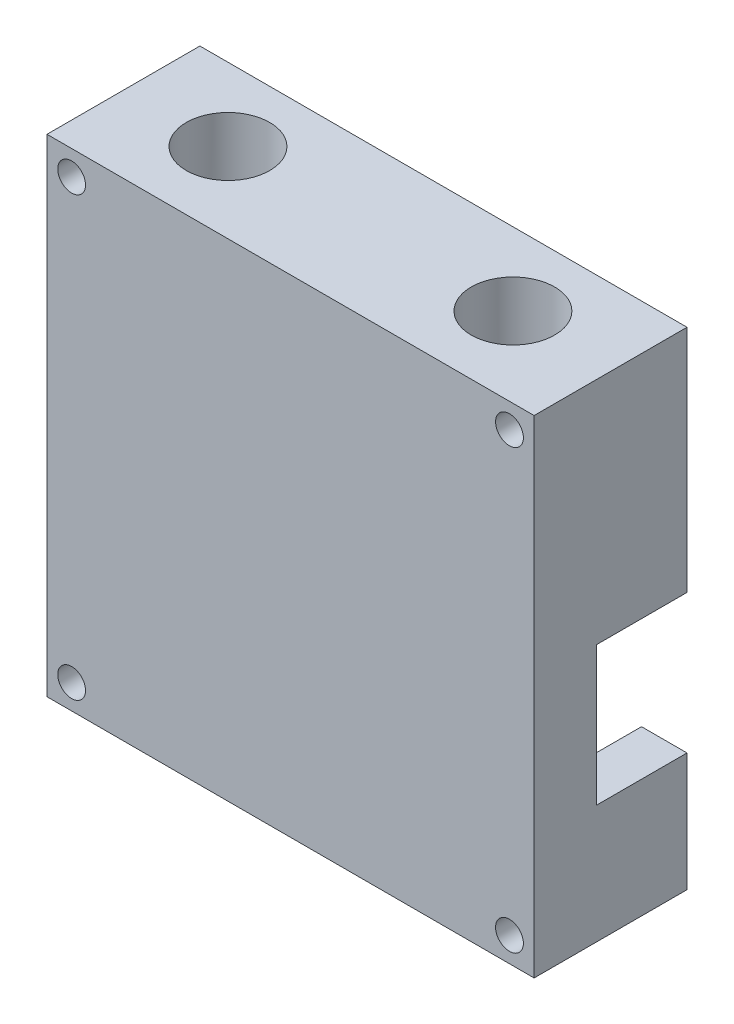
ISO-10303-21;
HEADER;
FILE_DESCRIPTION(('STEP AP214'),'2;1');
FILE_NAME('part.step','',(''),(''),'','','');
FILE_SCHEMA(('AUTOMOTIVE_DESIGN { 1 0 10303 214 1 1 1 1 }'));
ENDSEC;
DATA;
#1=APPLICATION_CONTEXT('core data for automotive mechanical design processes');
#2=APPLICATION_PROTOCOL_DEFINITION('international standard','automotive_design',2000,#1);
#3=PRODUCT_CONTEXT('',#1,'mechanical');
#4=PRODUCT('Part','Part','',(#3));
#5=PRODUCT_RELATED_PRODUCT_CATEGORY('part','',(#4));
#6=PRODUCT_DEFINITION_FORMATION('','',#4);
#7=PRODUCT_DEFINITION_CONTEXT('part definition',#1,'design');
#8=PRODUCT_DEFINITION('design','',#6,#7);
#9=PRODUCT_DEFINITION_SHAPE('','',#8);
#10=(LENGTH_UNIT() NAMED_UNIT(*) SI_UNIT(.MILLI.,.METRE.));
#11=(NAMED_UNIT(*) PLANE_ANGLE_UNIT() SI_UNIT($,.RADIAN.));
#12=(NAMED_UNIT(*) SI_UNIT($,.STERADIAN.) SOLID_ANGLE_UNIT());
#13=UNCERTAINTY_MEASURE_WITH_UNIT(LENGTH_MEASURE(1.E-05),#10,'distance_accuracy_value','');
#14=(GEOMETRIC_REPRESENTATION_CONTEXT(3) GLOBAL_UNCERTAINTY_ASSIGNED_CONTEXT((#13)) GLOBAL_UNIT_ASSIGNED_CONTEXT((#10,
#11,#12)) REPRESENTATION_CONTEXT('',''));
#15=CARTESIAN_POINT('',(0.,0.,0.));
#16=DIRECTION('',(0.,0.,1.));
#17=DIRECTION('',(1.,0.,0.));
#18=AXIS2_PLACEMENT_3D('',#15,#16,#17);
#19=CARTESIAN_POINT('',(0.,0.,0.));
#20=DIRECTION('',(0.,0.,1.));
#21=DIRECTION('',(1.,0.,0.));
#22=AXIS2_PLACEMENT_3D('',#19,#20,#21);
#23=PLANE('',#22);
#24=CARTESIAN_POINT('',(31.4999999999997,-31.5000000000003,0.));
#25=DIRECTION('',(0.,0.,1.));
#26=DIRECTION('',(1.,0.,0.));
#27=AXIS2_PLACEMENT_3D('',#24,#25,#26);
#28=CIRCLE('',#27,2.00000000000134);
#29=CARTESIAN_POINT('',(33.500000000001,-31.5000000000003,0.));
#30=VERTEX_POINT('',#29);
#31=EDGE_CURVE('E312',#30,#30,#28,.T.);
#32=ORIENTED_EDGE('',*,*,#31,.T.);
#33=EDGE_LOOP('',(#32));
#34=FACE_BOUND('',#33,.T.);
#35=DIRECTION('',(1.,0.,0.));
#36=VECTOR('',#35,1.);
#37=CARTESIAN_POINT('',(-35.0458892587831,-35.0458892587831,0.));
#38=LINE('',#37,#36);
#39=CARTESIAN_POINT('',(28.5,-35.0458892587831,0.));
#40=VERTEX_POINT('',#39);
#41=CARTESIAN_POINT('',(35.0458892587831,-35.0458892587831,0.));
#42=VERTEX_POINT('',#41);
#43=EDGE_CURVE('E370',#40,#42,#38,.T.);
#44=ORIENTED_EDGE('',*,*,#43,.F.);
#45=DIRECTION('',(0.,1.,0.));
#46=VECTOR('',#45,1.);
#47=CARTESIAN_POINT('',(28.5,25.5,0.));
#48=LINE('',#47,#46);
#49=CARTESIAN_POINT('',(28.5,-18.,0.));
#50=VERTEX_POINT('',#49);
#51=EDGE_CURVE('E185',#40,#50,#48,.T.);
#52=ORIENTED_EDGE('',*,*,#51,.T.);
#53=DIRECTION('',(1.,0.,0.));
#54=VECTOR('',#53,1.);
#55=CARTESIAN_POINT('',(25.0458892587831,-18.,0.));
#56=LINE('',#55,#54);
#57=CARTESIAN_POINT('',(35.0458892587831,-18.,0.));
#58=VERTEX_POINT('',#57);
#59=EDGE_CURVE('E213',#50,#58,#56,.T.);
#60=ORIENTED_EDGE('',*,*,#59,.T.);
#61=DIRECTION('',(0.,1.,0.));
#62=VECTOR('',#61,1.);
#63=CARTESIAN_POINT('',(35.0458892587831,35.0458892587831,0.));
#64=LINE('',#63,#62);
#65=EDGE_CURVE('E360',#42,#58,#64,.T.);
#66=ORIENTED_EDGE('',*,*,#65,.F.);
#67=EDGE_LOOP('',(#44,#52,#60,#66));
#68=FACE_BOUND('',#67,.T.);
#69=ADVANCED_FACE('F45',(#34,#68),#23,.F.);
#70=CARTESIAN_POINT('',(-31.5,-31.5,0.));
#71=DIRECTION('',(0.,0.,1.));
#72=DIRECTION('',(1.,0.,0.));
#73=AXIS2_PLACEMENT_3D('',#70,#71,#72);
#74=CIRCLE('',#73,2.00000000000134);
#75=CARTESIAN_POINT('',(-29.4999999999987,-31.5,0.));
#76=VERTEX_POINT('',#75);
#77=EDGE_CURVE('E317',#76,#76,#74,.T.);
#78=ORIENTED_EDGE('',*,*,#77,.T.);
#79=EDGE_LOOP('',(#78));
#80=FACE_BOUND('',#79,.T.);
#81=CARTESIAN_POINT('',(31.5000000000002,31.4999999999998,0.));
#82=DIRECTION('',(0.,0.,1.));
#83=DIRECTION('',(1.,0.,0.));
#84=AXIS2_PLACEMENT_3D('',#81,#82,#83);
#85=CIRCLE('',#84,2.00000000000134);
#86=CARTESIAN_POINT('',(33.5000000000016,31.4999999999998,0.));
#87=VERTEX_POINT('',#86);
#88=EDGE_CURVE('E325',#87,#87,#85,.T.);
#89=ORIENTED_EDGE('',*,*,#88,.T.);
#90=EDGE_LOOP('',(#89));
#91=FACE_BOUND('',#90,.T.);
#92=CARTESIAN_POINT('',(-31.4999999999999,31.5000000000001,0.));
#93=DIRECTION('',(0.,0.,1.));
#94=DIRECTION('',(1.,0.,0.));
#95=AXIS2_PLACEMENT_3D('',#92,#93,#94);
#96=CIRCLE('',#95,2.00000000000134);
#97=CARTESIAN_POINT('',(-29.4999999999986,31.5000000000001,0.));
#98=VERTEX_POINT('',#97);
#99=EDGE_CURVE('E333',#98,#98,#96,.T.);
#100=ORIENTED_EDGE('',*,*,#99,.T.);
#101=EDGE_LOOP('',(#100));
#102=FACE_BOUND('',#101,.T.);
#103=DIRECTION('',(0.,-1.,0.));
#104=VECTOR('',#103,1.);
#105=CARTESIAN_POINT('',(-28.5,25.5,0.));
#106=LINE('',#105,#104);
#107=CARTESIAN_POINT('',(-28.5,25.5,0.));
#108=VERTEX_POINT('',#107);
#109=CARTESIAN_POINT('',(-28.5,-35.0458892587831,0.));
#110=VERTEX_POINT('',#109);
#111=EDGE_CURVE('E280',#108,#110,#106,.T.);
#112=ORIENTED_EDGE('',*,*,#111,.T.);
#113=CARTESIAN_POINT('',(-35.0458892587831,-35.0458892587831,0.));
#114=VERTEX_POINT('',#113);
#115=EDGE_CURVE('E350',#114,#110,#38,.T.);
#116=ORIENTED_EDGE('',*,*,#115,.F.);
#117=DIRECTION('',(0.,-1.,0.));
#118=VECTOR('',#117,1.);
#119=CARTESIAN_POINT('',(-35.0458892587831,35.0458892587831,0.));
#120=LINE('',#119,#118);
#121=CARTESIAN_POINT('',(-35.0458892587831,35.0458892587831,0.));
#122=VERTEX_POINT('',#121);
#123=EDGE_CURVE('E367',#122,#114,#120,.T.);
#124=ORIENTED_EDGE('',*,*,#123,.F.);
#125=DIRECTION('',(-1.,0.,0.));
#126=VECTOR('',#125,1.);
#127=CARTESIAN_POINT('',(-35.0458892587831,35.0458892587831,0.));
#128=LINE('',#127,#126);
#129=CARTESIAN_POINT('',(35.0458892587831,35.0458892587831,0.));
#130=VERTEX_POINT('',#129);
#131=EDGE_CURVE('E364',#130,#122,#128,.T.);
#132=ORIENTED_EDGE('',*,*,#131,.F.);
#133=CARTESIAN_POINT('',(35.0458892587831,2.00000000000001,0.));
#134=VERTEX_POINT('',#133);
#135=EDGE_CURVE('E341',#134,#130,#64,.T.);
#136=ORIENTED_EDGE('',*,*,#135,.F.);
#137=DIRECTION('',(1.,0.,0.));
#138=VECTOR('',#137,1.);
#139=CARTESIAN_POINT('',(25.0458892587831,2.00000000000001,0.));
#140=LINE('',#139,#138);
#141=CARTESIAN_POINT('',(28.5,2.00000000000001,0.));
#142=VERTEX_POINT('',#141);
#143=EDGE_CURVE('E212',#142,#134,#140,.T.);
#144=ORIENTED_EDGE('',*,*,#143,.F.);
#145=CARTESIAN_POINT('',(28.5,25.5,0.));
#146=VERTEX_POINT('',#145);
#147=EDGE_CURVE('E283',#142,#146,#48,.T.);
#148=ORIENTED_EDGE('',*,*,#147,.T.);
#149=DIRECTION('',(-1.,0.,0.));
#150=VECTOR('',#149,1.);
#151=CARTESIAN_POINT('',(13.5,25.5,0.));
#152=LINE('',#151,#150);
#153=CARTESIAN_POINT('',(13.5,25.5,0.));
#154=VERTEX_POINT('',#153);
#155=EDGE_CURVE('E260',#146,#154,#152,.T.);
#156=ORIENTED_EDGE('',*,*,#155,.T.);
#157=DIRECTION('',(0.,1.,0.));
#158=VECTOR('',#157,1.);
#159=CARTESIAN_POINT('',(13.5,29.,0.));
#160=LINE('',#159,#158);
#161=CARTESIAN_POINT('',(13.5,29.,0.));
#162=VERTEX_POINT('',#161);
#163=EDGE_CURVE('E264',#154,#162,#160,.T.);
#164=ORIENTED_EDGE('',*,*,#163,.T.);
#165=DIRECTION('',(-1.,0.,0.));
#166=VECTOR('',#165,1.);
#167=CARTESIAN_POINT('',(13.5,29.,0.));
#168=LINE('',#167,#166);
#169=CARTESIAN_POINT('',(-13.5,29.,0.));
#170=VERTEX_POINT('',#169);
#171=EDGE_CURVE('E268',#162,#170,#168,.T.);
#172=ORIENTED_EDGE('',*,*,#171,.T.);
#173=DIRECTION('',(0.,-1.,0.));
#174=VECTOR('',#173,1.);
#175=CARTESIAN_POINT('',(-13.5,29.,0.));
#176=LINE('',#175,#174);
#177=CARTESIAN_POINT('',(-13.5,25.5,0.));
#178=VERTEX_POINT('',#177);
#179=EDGE_CURVE('E272',#170,#178,#176,.T.);
#180=ORIENTED_EDGE('',*,*,#179,.T.);
#181=DIRECTION('',(-1.,0.,0.));
#182=VECTOR('',#181,1.);
#183=CARTESIAN_POINT('',(-28.5,25.5,0.));
#184=LINE('',#183,#182);
#185=EDGE_CURVE('E276',#178,#108,#184,.T.);
#186=ORIENTED_EDGE('',*,*,#185,.T.);
#187=EDGE_LOOP('',(#112,#116,#124,#132,#136,#144,#148,#156,#164,#172,#180,#186));
#188=FACE_BOUND('',#187,.T.);
#189=ADVANCED_FACE('F408',(#80,#91,#102,#188),#23,.F.);
#190=CARTESIAN_POINT('',(0.,0.,22.));
#191=DIRECTION('',(0.,0.,1.));
#192=DIRECTION('',(1.,0.,0.));
#193=AXIS2_PLACEMENT_3D('',#190,#191,#192);
#194=PLANE('',#193);
#195=CARTESIAN_POINT('',(-31.5,-31.5,22.));
#196=DIRECTION('',(0.,0.,1.));
#197=DIRECTION('',(1.,0.,0.));
#198=AXIS2_PLACEMENT_3D('',#195,#196,#197);
#199=CIRCLE('',#198,2.00000000000134);
#200=CARTESIAN_POINT('',(-29.4999999999987,-31.5,22.));
#201=VERTEX_POINT('',#200);
#202=EDGE_CURVE('E321',#201,#201,#199,.T.);
#203=ORIENTED_EDGE('',*,*,#202,.F.);
#204=EDGE_LOOP('',(#203));
#205=FACE_BOUND('',#204,.T.);
#206=CARTESIAN_POINT('',(-31.4999999999999,31.5000000000001,22.));
#207=DIRECTION('',(0.,0.,1.));
#208=DIRECTION('',(1.,0.,0.));
#209=AXIS2_PLACEMENT_3D('',#206,#207,#208);
#210=CIRCLE('',#209,2.00000000000134);
#211=CARTESIAN_POINT('',(-29.4999999999986,31.5000000000001,22.));
#212=VERTEX_POINT('',#211);
#213=EDGE_CURVE('E337',#212,#212,#210,.T.);
#214=ORIENTED_EDGE('',*,*,#213,.F.);
#215=EDGE_LOOP('',(#214));
#216=FACE_BOUND('',#215,.T.);
#217=DIRECTION('',(0.,1.,0.));
#218=VECTOR('',#217,1.);
#219=CARTESIAN_POINT('',(35.0458892587831,35.0458892587831,22.));
#220=LINE('',#219,#218);
#221=CARTESIAN_POINT('',(35.0458892587831,-35.0458892587831,22.));
#222=VERTEX_POINT('',#221);
#223=CARTESIAN_POINT('',(35.0458892587831,35.0458892587831,22.));
#224=VERTEX_POINT('',#223);
#225=EDGE_CURVE('E345',#222,#224,#220,.T.);
#226=ORIENTED_EDGE('',*,*,#225,.T.);
#227=DIRECTION('',(-1.,0.,0.));
#228=VECTOR('',#227,1.);
#229=CARTESIAN_POINT('',(-35.0458892587831,35.0458892587831,22.));
#230=LINE('',#229,#228);
#231=CARTESIAN_POINT('',(-35.0458892587831,35.0458892587831,22.));
#232=VERTEX_POINT('',#231);
#233=EDGE_CURVE('E349',#224,#232,#230,.T.);
#234=ORIENTED_EDGE('',*,*,#233,.T.);
#235=DIRECTION('',(0.,-1.,0.));
#236=VECTOR('',#235,1.);
#237=CARTESIAN_POINT('',(-35.0458892587831,35.0458892587831,22.));
#238=LINE('',#237,#236);
#239=CARTESIAN_POINT('',(-35.0458892587831,-35.0458892587831,22.));
#240=VERTEX_POINT('',#239);
#241=EDGE_CURVE('E353',#232,#240,#238,.T.);
#242=ORIENTED_EDGE('',*,*,#241,.T.);
#243=DIRECTION('',(1.,0.,0.));
#244=VECTOR('',#243,1.);
#245=CARTESIAN_POINT('',(-35.0458892587831,-35.0458892587831,22.));
#246=LINE('',#245,#244);
#247=EDGE_CURVE('E356',#240,#222,#246,.T.);
#248=ORIENTED_EDGE('',*,*,#247,.T.);
#249=EDGE_LOOP('',(#226,#234,#242,#248));
#250=FACE_BOUND('',#249,.T.);
#251=CARTESIAN_POINT('',(31.5000000000002,31.4999999999998,22.));
#252=DIRECTION('',(0.,0.,1.));
#253=DIRECTION('',(1.,0.,0.));
#254=AXIS2_PLACEMENT_3D('',#251,#252,#253);
#255=CIRCLE('',#254,2.00000000000134);
#256=CARTESIAN_POINT('',(33.5000000000016,31.4999999999998,22.));
#257=VERTEX_POINT('',#256);
#258=EDGE_CURVE('E329',#257,#257,#255,.T.);
#259=ORIENTED_EDGE('',*,*,#258,.F.);
#260=EDGE_LOOP('',(#259));
#261=FACE_BOUND('',#260,.T.);
#262=CARTESIAN_POINT('',(31.4999999999997,-31.5000000000003,22.));
#263=DIRECTION('',(0.,0.,1.));
#264=DIRECTION('',(1.,0.,0.));
#265=AXIS2_PLACEMENT_3D('',#262,#263,#264);
#266=CIRCLE('',#265,2.00000000000134);
#267=CARTESIAN_POINT('',(33.500000000001,-31.5000000000003,22.));
#268=VERTEX_POINT('',#267);
#269=EDGE_CURVE('E313',#268,#268,#266,.T.);
#270=ORIENTED_EDGE('',*,*,#269,.F.);
#271=EDGE_LOOP('',(#270));
#272=FACE_BOUND('',#271,.T.);
#273=ADVANCED_FACE('F445',(#205,#216,#250,#261,#272),#194,.T.);
#274=CARTESIAN_POINT('',(35.0458892587831,35.0458892587831,22.));
#275=DIRECTION('',(-1.,0.,0.));
#276=DIRECTION('',(0.,-1.,0.));
#277=AXIS2_PLACEMENT_3D('',#274,#275,#276);
#278=PLANE('',#277);
#279=ORIENTED_EDGE('',*,*,#65,.T.);
#280=DIRECTION('',(0.,0.,-1.));
#281=VECTOR('',#280,1.);
#282=CARTESIAN_POINT('',(35.0458892587831,-18.,0.));
#283=LINE('',#282,#281);
#284=CARTESIAN_POINT('',(35.0458892587831,-18.,13.));
#285=VERTEX_POINT('',#284);
#286=EDGE_CURVE('E209',#285,#58,#283,.T.);
#287=ORIENTED_EDGE('',*,*,#286,.F.);
#288=DIRECTION('',(0.,-1.,0.));
#289=VECTOR('',#288,1.);
#290=CARTESIAN_POINT('',(35.0458892587831,2.00000000000001,13.));
#291=LINE('',#290,#289);
#292=CARTESIAN_POINT('',(35.0458892587831,2.00000000000001,13.));
#293=VERTEX_POINT('',#292);
#294=EDGE_CURVE('E205',#293,#285,#291,.T.);
#295=ORIENTED_EDGE('',*,*,#294,.F.);
#296=DIRECTION('',(0.,0.,1.));
#297=VECTOR('',#296,1.);
#298=CARTESIAN_POINT('',(35.0458892587831,2.00000000000001,0.));
#299=LINE('',#298,#297);
#300=EDGE_CURVE('E202',#134,#293,#299,.T.);
#301=ORIENTED_EDGE('',*,*,#300,.F.);
#302=ORIENTED_EDGE('',*,*,#135,.T.);
#303=DIRECTION('',(0.,0.,-1.));
#304=VECTOR('',#303,1.);
#305=CARTESIAN_POINT('',(35.0458892587831,35.0458892587831,22.));
#306=LINE('',#305,#304);
#307=EDGE_CURVE('E384',#224,#130,#306,.T.);
#308=ORIENTED_EDGE('',*,*,#307,.F.);
#309=ORIENTED_EDGE('',*,*,#225,.F.);
#310=DIRECTION('',(0.,0.,-1.));
#311=VECTOR('',#310,1.);
#312=CARTESIAN_POINT('',(35.0458892587831,-35.0458892587831,22.));
#313=LINE('',#312,#311);
#314=EDGE_CURVE('E359',#222,#42,#313,.T.);
#315=ORIENTED_EDGE('',*,*,#314,.T.);
#316=EDGE_LOOP('',(#279,#287,#295,#301,#302,#308,#309,#315));
#317=FACE_BOUND('',#316,.T.);
#318=ADVANCED_FACE('F47',(#317),#278,.F.);
#319=CARTESIAN_POINT('',(-35.0458892587831,35.0458892587831,22.));
#320=DIRECTION('',(0.,-1.,0.));
#321=DIRECTION('',(0.,0.,-1.));
#322=AXIS2_PLACEMENT_3D('',#319,#320,#321);
#323=PLANE('',#322);
#324=CARTESIAN_POINT('',(-20.5,35.0458892587831,10.5));
#325=DIRECTION('',(0.,1.,0.));
#326=DIRECTION('',(0.,0.,1.));
#327=AXIS2_PLACEMENT_3D('',#324,#325,#326);
#328=CIRCLE('',#327,6.);
#329=CARTESIAN_POINT('',(-20.5,35.0458892587831,16.5));
#330=VERTEX_POINT('',#329);
#331=EDGE_CURVE('E217',#330,#330,#328,.T.);
#332=ORIENTED_EDGE('',*,*,#331,.F.);
#333=EDGE_LOOP('',(#332));
#334=FACE_BOUND('',#333,.T.);
#335=CARTESIAN_POINT('',(20.5,35.0458892587831,10.5));
#336=DIRECTION('',(0.,1.,0.));
#337=DIRECTION('',(0.,0.,1.));
#338=AXIS2_PLACEMENT_3D('',#335,#336,#337);
#339=CIRCLE('',#338,6.);
#340=CARTESIAN_POINT('',(20.5,35.0458892587831,16.5));
#341=VERTEX_POINT('',#340);
#342=EDGE_CURVE('E229',#341,#341,#339,.T.);
#343=ORIENTED_EDGE('',*,*,#342,.F.);
#344=EDGE_LOOP('',(#343));
#345=FACE_BOUND('',#344,.T.);
#346=ORIENTED_EDGE('',*,*,#131,.T.);
#347=DIRECTION('',(0.,0.,-1.));
#348=VECTOR('',#347,1.);
#349=CARTESIAN_POINT('',(-35.0458892587831,35.0458892587831,22.));
#350=LINE('',#349,#348);
#351=EDGE_CURVE('E380',#232,#122,#350,.T.);
#352=ORIENTED_EDGE('',*,*,#351,.F.);
#353=ORIENTED_EDGE('',*,*,#233,.F.);
#354=ORIENTED_EDGE('',*,*,#307,.T.);
#355=EDGE_LOOP('',(#346,#352,#353,#354));
#356=FACE_BOUND('',#355,.T.);
#357=ADVANCED_FACE('F455',(#334,#345,#356),#323,.F.);
#358=CARTESIAN_POINT('',(-35.0458892587831,35.0458892587831,22.));
#359=DIRECTION('',(1.,0.,0.));
#360=DIRECTION('',(0.,0.,-1.));
#361=AXIS2_PLACEMENT_3D('',#358,#359,#360);
#362=PLANE('',#361);
#363=ORIENTED_EDGE('',*,*,#123,.T.);
#364=DIRECTION('',(0.,0.,-1.));
#365=VECTOR('',#364,1.);
#366=CARTESIAN_POINT('',(-35.0458892587831,-35.0458892587831,22.));
#367=LINE('',#366,#365);
#368=EDGE_CURVE('E376',#240,#114,#367,.T.);
#369=ORIENTED_EDGE('',*,*,#368,.F.);
#370=ORIENTED_EDGE('',*,*,#241,.F.);
#371=ORIENTED_EDGE('',*,*,#351,.T.);
#372=EDGE_LOOP('',(#363,#369,#370,#371));
#373=FACE_BOUND('',#372,.T.);
#374=ADVANCED_FACE('F453',(#373),#362,.F.);
#375=CARTESIAN_POINT('',(-35.0458892587831,-35.0458892587831,22.));
#376=DIRECTION('',(0.,1.,0.));
#377=DIRECTION('',(0.,0.,1.));
#378=AXIS2_PLACEMENT_3D('',#375,#376,#377);
#379=PLANE('',#378);
#380=DIRECTION('',(-1.,0.,0.));
#381=VECTOR('',#380,1.);
#382=CARTESIAN_POINT('',(28.5,-35.0458892587831,13.));
#383=LINE('',#382,#381);
#384=CARTESIAN_POINT('',(28.5,-35.0458892587831,13.));
#385=VERTEX_POINT('',#384);
#386=CARTESIAN_POINT('',(-28.5,-35.0458892587831,13.));
#387=VERTEX_POINT('',#386);
#388=EDGE_CURVE('E172',#385,#387,#383,.T.);
#389=ORIENTED_EDGE('',*,*,#388,.F.);
#390=DIRECTION('',(0.,0.,1.));
#391=VECTOR('',#390,1.);
#392=CARTESIAN_POINT('',(28.5,-35.0458892587831,0.));
#393=LINE('',#392,#391);
#394=EDGE_CURVE('E182',#40,#385,#393,.T.);
#395=ORIENTED_EDGE('',*,*,#394,.F.);
#396=ORIENTED_EDGE('',*,*,#43,.T.);
#397=ORIENTED_EDGE('',*,*,#314,.F.);
#398=ORIENTED_EDGE('',*,*,#247,.F.);
#399=ORIENTED_EDGE('',*,*,#368,.T.);
#400=ORIENTED_EDGE('',*,*,#115,.T.);
#401=DIRECTION('',(0.,0.,-1.));
#402=VECTOR('',#401,1.);
#403=CARTESIAN_POINT('',(-28.5,-35.0458892587831,0.));
#404=LINE('',#403,#402);
#405=EDGE_CURVE('E179',#387,#110,#404,.T.);
#406=ORIENTED_EDGE('',*,*,#405,.F.);
#407=EDGE_LOOP('',(#389,#395,#396,#397,#398,#399,#400,#406));
#408=FACE_BOUND('',#407,.T.);
#409=ADVANCED_FACE('F190',(#408),#379,.F.);
#410=CARTESIAN_POINT('',(-31.4999999999999,31.5000000000001,22.));
#411=DIRECTION('',(0.,0.,-1.));
#412=DIRECTION('',(-1.,0.,0.));
#413=AXIS2_PLACEMENT_3D('',#410,#411,#412);
#414=CYLINDRICAL_SURFACE('',#413,2.00000000000134);
#415=ORIENTED_EDGE('',*,*,#213,.T.);
#416=EDGE_LOOP('',(#415));
#417=FACE_BOUND('',#416,.T.);
#418=ORIENTED_EDGE('',*,*,#99,.F.);
#419=EDGE_LOOP('',(#418));
#420=FACE_BOUND('',#419,.T.);
#421=ADVANCED_FACE('F452',(#417,#420),#414,.F.);
#422=CARTESIAN_POINT('',(31.5000000000002,31.4999999999998,22.));
#423=DIRECTION('',(0.,0.,-1.));
#424=DIRECTION('',(-1.,0.,0.));
#425=AXIS2_PLACEMENT_3D('',#422,#423,#424);
#426=CYLINDRICAL_SURFACE('',#425,2.00000000000134);
#427=ORIENTED_EDGE('',*,*,#258,.T.);
#428=EDGE_LOOP('',(#427));
#429=FACE_BOUND('',#428,.T.);
#430=ORIENTED_EDGE('',*,*,#88,.F.);
#431=EDGE_LOOP('',(#430));
#432=FACE_BOUND('',#431,.T.);
#433=ADVANCED_FACE('F493',(#429,#432),#426,.F.);
#434=CARTESIAN_POINT('',(-31.5,-31.5,22.));
#435=DIRECTION('',(0.,0.,-1.));
#436=DIRECTION('',(-1.,0.,0.));
#437=AXIS2_PLACEMENT_3D('',#434,#435,#436);
#438=CYLINDRICAL_SURFACE('',#437,2.00000000000134);
#439=ORIENTED_EDGE('',*,*,#202,.T.);
#440=EDGE_LOOP('',(#439));
#441=FACE_BOUND('',#440,.T.);
#442=ORIENTED_EDGE('',*,*,#77,.F.);
#443=EDGE_LOOP('',(#442));
#444=FACE_BOUND('',#443,.T.);
#445=ADVANCED_FACE('F483',(#441,#444),#438,.F.);
#446=CARTESIAN_POINT('',(31.4999999999997,-31.5000000000003,22.));
#447=DIRECTION('',(0.,0.,-1.));
#448=DIRECTION('',(-1.,0.,0.));
#449=AXIS2_PLACEMENT_3D('',#446,#447,#448);
#450=CYLINDRICAL_SURFACE('',#449,2.00000000000134);
#451=ORIENTED_EDGE('',*,*,#269,.T.);
#452=EDGE_LOOP('',(#451));
#453=FACE_BOUND('',#452,.T.);
#454=ORIENTED_EDGE('',*,*,#31,.F.);
#455=EDGE_LOOP('',(#454));
#456=FACE_BOUND('',#455,.T.);
#457=ADVANCED_FACE('F479',(#453,#456),#450,.F.);
#458=CARTESIAN_POINT('',(13.5,25.5,19.));
#459=DIRECTION('',(0.,-1.,0.));
#460=DIRECTION('',(1.,0.,0.));
#461=AXIS2_PLACEMENT_3D('',#458,#459,#460);
#462=PLANE('',#461);
#463=CARTESIAN_POINT('',(20.5,25.5,10.5));
#464=DIRECTION('',(0.,-1.,0.));
#465=DIRECTION('',(1.,0.,0.));
#466=AXIS2_PLACEMENT_3D('',#463,#464,#465);
#467=CIRCLE('',#466,6.);
#468=CARTESIAN_POINT('',(26.5,25.5,10.5));
#469=VERTEX_POINT('',#468);
#470=EDGE_CURVE('E233',#469,#469,#467,.T.);
#471=ORIENTED_EDGE('',*,*,#470,.F.);
#472=EDGE_LOOP('',(#471));
#473=FACE_BOUND('',#472,.T.);
#474=ORIENTED_EDGE('',*,*,#155,.F.);
#475=DIRECTION('',(0.,0.,-1.));
#476=VECTOR('',#475,1.);
#477=CARTESIAN_POINT('',(28.5,25.5,19.));
#478=LINE('',#477,#476);
#479=CARTESIAN_POINT('',(28.5,25.5,19.));
#480=VERTEX_POINT('',#479);
#481=EDGE_CURVE('E259',#480,#146,#478,.T.);
#482=ORIENTED_EDGE('',*,*,#481,.F.);
#483=DIRECTION('',(-1.,0.,0.));
#484=VECTOR('',#483,1.);
#485=CARTESIAN_POINT('',(13.5,25.5,19.));
#486=LINE('',#485,#484);
#487=CARTESIAN_POINT('',(13.5,25.5,19.));
#488=VERTEX_POINT('',#487);
#489=EDGE_CURVE('E234',#480,#488,#486,.T.);
#490=ORIENTED_EDGE('',*,*,#489,.T.);
#491=DIRECTION('',(0.,0.,-1.));
#492=VECTOR('',#491,1.);
#493=CARTESIAN_POINT('',(13.5,25.5,19.));
#494=LINE('',#493,#492);
#495=EDGE_CURVE('E308',#488,#154,#494,.T.);
#496=ORIENTED_EDGE('',*,*,#495,.T.);
#497=EDGE_LOOP('',(#474,#482,#490,#496));
#498=FACE_BOUND('',#497,.T.);
#499=ADVANCED_FACE('F482',(#473,#498),#462,.T.);
#500=CARTESIAN_POINT('',(13.5,29.,19.));
#501=DIRECTION('',(-1.,0.,0.));
#502=DIRECTION('',(0.,0.,1.));
#503=AXIS2_PLACEMENT_3D('',#500,#501,#502);
#504=PLANE('',#503);
#505=ORIENTED_EDGE('',*,*,#163,.F.);
#506=ORIENTED_EDGE('',*,*,#495,.F.);
#507=DIRECTION('',(0.,1.,0.));
#508=VECTOR('',#507,1.);
#509=CARTESIAN_POINT('',(13.5,29.,19.));
#510=LINE('',#509,#508);
#511=CARTESIAN_POINT('',(13.5,29.,19.));
#512=VERTEX_POINT('',#511);
#513=EDGE_CURVE('E238',#488,#512,#510,.T.);
#514=ORIENTED_EDGE('',*,*,#513,.T.);
#515=DIRECTION('',(0.,0.,-1.));
#516=VECTOR('',#515,1.);
#517=CARTESIAN_POINT('',(13.5,29.,19.));
#518=LINE('',#517,#516);
#519=EDGE_CURVE('E305',#512,#162,#518,.T.);
#520=ORIENTED_EDGE('',*,*,#519,.T.);
#521=EDGE_LOOP('',(#505,#506,#514,#520));
#522=FACE_BOUND('',#521,.T.);
#523=ADVANCED_FACE('F490',(#522),#504,.T.);
#524=CARTESIAN_POINT('',(13.5,29.,19.));
#525=DIRECTION('',(0.,-1.,0.));
#526=DIRECTION('',(0.,0.,-1.));
#527=AXIS2_PLACEMENT_3D('',#524,#525,#526);
#528=PLANE('',#527);
#529=ORIENTED_EDGE('',*,*,#171,.F.);
#530=ORIENTED_EDGE('',*,*,#519,.F.);
#531=DIRECTION('',(-1.,0.,0.));
#532=VECTOR('',#531,1.);
#533=CARTESIAN_POINT('',(13.5,29.,19.));
#534=LINE('',#533,#532);
#535=CARTESIAN_POINT('',(-13.5,29.,19.));
#536=VERTEX_POINT('',#535);
#537=EDGE_CURVE('E241',#512,#536,#534,.T.);
#538=ORIENTED_EDGE('',*,*,#537,.T.);
#539=DIRECTION('',(0.,0.,-1.));
#540=VECTOR('',#539,1.);
#541=CARTESIAN_POINT('',(-13.5,29.,19.));
#542=LINE('',#541,#540);
#543=EDGE_CURVE('E302',#536,#170,#542,.T.);
#544=ORIENTED_EDGE('',*,*,#543,.T.);
#545=EDGE_LOOP('',(#529,#530,#538,#544));
#546=FACE_BOUND('',#545,.T.);
#547=ADVANCED_FACE('F536',(#546),#528,.T.);
#548=CARTESIAN_POINT('',(-13.5,29.,19.));
#549=DIRECTION('',(1.,0.,0.));
#550=DIRECTION('',(0.,0.,-1.));
#551=AXIS2_PLACEMENT_3D('',#548,#549,#550);
#552=PLANE('',#551);
#553=ORIENTED_EDGE('',*,*,#179,.F.);
#554=ORIENTED_EDGE('',*,*,#543,.F.);
#555=DIRECTION('',(0.,-1.,0.));
#556=VECTOR('',#555,1.);
#557=CARTESIAN_POINT('',(-13.5,29.,19.));
#558=LINE('',#557,#556);
#559=CARTESIAN_POINT('',(-13.5,25.5,19.));
#560=VERTEX_POINT('',#559);
#561=EDGE_CURVE('E244',#536,#560,#558,.T.);
#562=ORIENTED_EDGE('',*,*,#561,.T.);
#563=DIRECTION('',(0.,0.,-1.));
#564=VECTOR('',#563,1.);
#565=CARTESIAN_POINT('',(-13.5,25.5,19.));
#566=LINE('',#565,#564);
#567=EDGE_CURVE('E299',#560,#178,#566,.T.);
#568=ORIENTED_EDGE('',*,*,#567,.T.);
#569=EDGE_LOOP('',(#553,#554,#562,#568));
#570=FACE_BOUND('',#569,.T.);
#571=ADVANCED_FACE('F547',(#570),#552,.T.);
#572=CARTESIAN_POINT('',(-28.5,25.5,19.));
#573=DIRECTION('',(0.,-1.,0.));
#574=DIRECTION('',(0.,0.,-1.));
#575=AXIS2_PLACEMENT_3D('',#572,#573,#574);
#576=PLANE('',#575);
#577=CARTESIAN_POINT('',(-20.5,25.5,10.5));
#578=DIRECTION('',(0.,-1.,0.));
#579=DIRECTION('',(0.,0.,-1.));
#580=AXIS2_PLACEMENT_3D('',#577,#578,#579);
#581=CIRCLE('',#580,6.);
#582=CARTESIAN_POINT('',(-20.5,25.5,4.5));
#583=VERTEX_POINT('',#582);
#584=EDGE_CURVE('E228',#583,#583,#581,.T.);
#585=ORIENTED_EDGE('',*,*,#584,.F.);
#586=EDGE_LOOP('',(#585));
#587=FACE_BOUND('',#586,.T.);
#588=ORIENTED_EDGE('',*,*,#185,.F.);
#589=ORIENTED_EDGE('',*,*,#567,.F.);
#590=DIRECTION('',(-1.,0.,0.));
#591=VECTOR('',#590,1.);
#592=CARTESIAN_POINT('',(-28.5,25.5,19.));
#593=LINE('',#592,#591);
#594=CARTESIAN_POINT('',(-28.5,25.5,19.));
#595=VERTEX_POINT('',#594);
#596=EDGE_CURVE('E247',#560,#595,#593,.T.);
#597=ORIENTED_EDGE('',*,*,#596,.T.);
#598=DIRECTION('',(0.,0.,-1.));
#599=VECTOR('',#598,1.);
#600=CARTESIAN_POINT('',(-28.5,25.5,19.));
#601=LINE('',#600,#599);
#602=EDGE_CURVE('E296',#595,#108,#601,.T.);
#603=ORIENTED_EDGE('',*,*,#602,.T.);
#604=EDGE_LOOP('',(#588,#589,#597,#603));
#605=FACE_BOUND('',#604,.T.);
#606=ADVANCED_FACE('F558',(#587,#605),#576,.T.);
#607=CARTESIAN_POINT('',(-28.5,25.5,19.));
#608=DIRECTION('',(1.,0.,0.));
#609=DIRECTION('',(0.,0.,-1.));
#610=AXIS2_PLACEMENT_3D('',#607,#608,#609);
#611=PLANE('',#610);
#612=DIRECTION('',(0.,0.,-1.));
#613=VECTOR('',#612,1.);
#614=CARTESIAN_POINT('',(-28.5,-27.6,19.));
#615=LINE('',#614,#613);
#616=CARTESIAN_POINT('',(-28.5,-27.6,19.));
#617=VERTEX_POINT('',#616);
#618=CARTESIAN_POINT('',(-28.5,-27.6,13.));
#619=VERTEX_POINT('',#618);
#620=EDGE_CURVE('E292',#617,#619,#615,.T.);
#621=ORIENTED_EDGE('',*,*,#620,.T.);
#622=DIRECTION('',(0.,-1.,0.));
#623=VECTOR('',#622,1.);
#624=CARTESIAN_POINT('',(-28.5,-19.0458892587831,13.));
#625=LINE('',#624,#623);
#626=EDGE_CURVE('E61',#619,#387,#625,.T.);
#627=ORIENTED_EDGE('',*,*,#626,.T.);
#628=ORIENTED_EDGE('',*,*,#405,.T.);
#629=ORIENTED_EDGE('',*,*,#111,.F.);
#630=ORIENTED_EDGE('',*,*,#602,.F.);
#631=DIRECTION('',(0.,-1.,0.));
#632=VECTOR('',#631,1.);
#633=CARTESIAN_POINT('',(-28.5,25.5,19.));
#634=LINE('',#633,#632);
#635=EDGE_CURVE('E250',#595,#617,#634,.T.);
#636=ORIENTED_EDGE('',*,*,#635,.T.);
#637=EDGE_LOOP('',(#621,#627,#628,#629,#630,#636));
#638=FACE_BOUND('',#637,.T.);
#639=ADVANCED_FACE('F606',(#638),#611,.T.);
#640=CARTESIAN_POINT('',(28.5,-27.6,19.));
#641=DIRECTION('',(0.,1.,0.));
#642=DIRECTION('',(-1.,0.,0.));
#643=AXIS2_PLACEMENT_3D('',#640,#641,#642);
#644=PLANE('',#643);
#645=DIRECTION('',(1.,0.,0.));
#646=VECTOR('',#645,1.);
#647=CARTESIAN_POINT('',(28.5,-27.6,13.));
#648=LINE('',#647,#646);
#649=CARTESIAN_POINT('',(28.5,-27.6,13.));
#650=VERTEX_POINT('',#649);
#651=EDGE_CURVE('E174',#619,#650,#648,.T.);
#652=ORIENTED_EDGE('',*,*,#651,.F.);
#653=ORIENTED_EDGE('',*,*,#620,.F.);
#654=DIRECTION('',(1.,0.,0.));
#655=VECTOR('',#654,1.);
#656=CARTESIAN_POINT('',(28.5,-27.6,19.));
#657=LINE('',#656,#655);
#658=CARTESIAN_POINT('',(28.5,-27.6,19.));
#659=VERTEX_POINT('',#658);
#660=EDGE_CURVE('E253',#617,#659,#657,.T.);
#661=ORIENTED_EDGE('',*,*,#660,.T.);
#662=DIRECTION('',(0.,0.,-1.));
#663=VECTOR('',#662,1.);
#664=CARTESIAN_POINT('',(28.5,-27.6,19.));
#665=LINE('',#664,#663);
#666=EDGE_CURVE('E289',#659,#650,#665,.T.);
#667=ORIENTED_EDGE('',*,*,#666,.T.);
#668=EDGE_LOOP('',(#652,#653,#661,#667));
#669=FACE_BOUND('',#668,.T.);
#670=ADVANCED_FACE('F668',(#669),#644,.T.);
#671=CARTESIAN_POINT('',(28.5,25.5,19.));
#672=DIRECTION('',(-1.,0.,0.));
#673=DIRECTION('',(0.,0.,1.));
#674=AXIS2_PLACEMENT_3D('',#671,#672,#673);
#675=PLANE('',#674);
#676=ORIENTED_EDGE('',*,*,#51,.F.);
#677=ORIENTED_EDGE('',*,*,#394,.T.);
#678=DIRECTION('',(0.,-1.,0.));
#679=VECTOR('',#678,1.);
#680=CARTESIAN_POINT('',(28.5,-19.0458892587831,13.));
#681=LINE('',#680,#679);
#682=EDGE_CURVE('E168',#650,#385,#681,.T.);
#683=ORIENTED_EDGE('',*,*,#682,.F.);
#684=ORIENTED_EDGE('',*,*,#666,.F.);
#685=DIRECTION('',(0.,1.,0.));
#686=VECTOR('',#685,1.);
#687=CARTESIAN_POINT('',(28.5,25.5,19.));
#688=LINE('',#687,#686);
#689=EDGE_CURVE('E256',#659,#480,#688,.T.);
#690=ORIENTED_EDGE('',*,*,#689,.T.);
#691=ORIENTED_EDGE('',*,*,#481,.T.);
#692=ORIENTED_EDGE('',*,*,#147,.F.);
#693=DIRECTION('',(0.,0.,-1.));
#694=VECTOR('',#693,1.);
#695=CARTESIAN_POINT('',(28.5,2.,19.));
#696=LINE('',#695,#694);
#697=CARTESIAN_POINT('',(28.5,2.,13.));
#698=VERTEX_POINT('',#697);
#699=EDGE_CURVE('E388',#698,#142,#696,.T.);
#700=ORIENTED_EDGE('',*,*,#699,.F.);
#701=DIRECTION('',(0.,1.,0.));
#702=VECTOR('',#701,1.);
#703=CARTESIAN_POINT('',(28.5,25.5,13.));
#704=LINE('',#703,#702);
#705=CARTESIAN_POINT('',(28.5,-18.,13.));
#706=VERTEX_POINT('',#705);
#707=EDGE_CURVE('E54',#706,#698,#704,.T.);
#708=ORIENTED_EDGE('',*,*,#707,.F.);
#709=DIRECTION('',(0.,0.,1.));
#710=VECTOR('',#709,1.);
#711=CARTESIAN_POINT('',(28.5,-18.,19.));
#712=LINE('',#711,#710);
#713=EDGE_CURVE('E11',#50,#706,#712,.T.);
#714=ORIENTED_EDGE('',*,*,#713,.F.);
#715=EDGE_LOOP('',(#676,#677,#683,#684,#690,#691,#692,#700,#708,#714));
#716=FACE_BOUND('',#715,.T.);
#717=ADVANCED_FACE('F183',(#716),#675,.T.);
#718=CARTESIAN_POINT('',(0.,0.,19.));
#719=DIRECTION('',(0.,0.,-1.));
#720=DIRECTION('',(-1.,0.,0.));
#721=AXIS2_PLACEMENT_3D('',#718,#719,#720);
#722=PLANE('',#721);
#723=ORIENTED_EDGE('',*,*,#489,.F.);
#724=ORIENTED_EDGE('',*,*,#689,.F.);
#725=ORIENTED_EDGE('',*,*,#660,.F.);
#726=ORIENTED_EDGE('',*,*,#635,.F.);
#727=ORIENTED_EDGE('',*,*,#596,.F.);
#728=ORIENTED_EDGE('',*,*,#561,.F.);
#729=ORIENTED_EDGE('',*,*,#537,.F.);
#730=ORIENTED_EDGE('',*,*,#513,.F.);
#731=EDGE_LOOP('',(#723,#724,#725,#726,#727,#728,#729,#730));
#732=FACE_BOUND('',#731,.T.);
#733=ADVANCED_FACE('F567',(#732),#722,.T.);
#734=CARTESIAN_POINT('',(20.5,20.0458892587831,10.5));
#735=DIRECTION('',(0.,1.,0.));
#736=DIRECTION('',(0.,0.,1.));
#737=AXIS2_PLACEMENT_3D('',#734,#735,#736);
#738=CYLINDRICAL_SURFACE('',#737,6.);
#739=ORIENTED_EDGE('',*,*,#470,.T.);
#740=EDGE_LOOP('',(#739));
#741=FACE_BOUND('',#740,.T.);
#742=ORIENTED_EDGE('',*,*,#342,.T.);
#743=EDGE_LOOP('',(#742));
#744=FACE_BOUND('',#743,.T.);
#745=ADVANCED_FACE('F435',(#741,#744),#738,.F.);
#746=CARTESIAN_POINT('',(-20.5,20.0458892587831,10.5));
#747=DIRECTION('',(0.,1.,0.));
#748=DIRECTION('',(0.,0.,1.));
#749=AXIS2_PLACEMENT_3D('',#746,#747,#748);
#750=CYLINDRICAL_SURFACE('',#749,6.);
#751=ORIENTED_EDGE('',*,*,#584,.T.);
#752=EDGE_LOOP('',(#751));
#753=FACE_BOUND('',#752,.T.);
#754=ORIENTED_EDGE('',*,*,#331,.T.);
#755=EDGE_LOOP('',(#754));
#756=FACE_BOUND('',#755,.T.);
#757=ADVANCED_FACE('F428',(#753,#756),#750,.F.);
#758=CARTESIAN_POINT('',(25.0458892587831,-18.,0.));
#759=DIRECTION('',(0.,-1.,0.));
#760=DIRECTION('',(1.,0.,0.));
#761=AXIS2_PLACEMENT_3D('',#758,#759,#760);
#762=PLANE('',#761);
#763=ORIENTED_EDGE('',*,*,#713,.T.);
#764=DIRECTION('',(1.,0.,0.));
#765=VECTOR('',#764,1.);
#766=CARTESIAN_POINT('',(25.0458892587831,-18.,13.));
#767=LINE('',#766,#765);
#768=EDGE_CURVE('E218',#706,#285,#767,.T.);
#769=ORIENTED_EDGE('',*,*,#768,.T.);
#770=ORIENTED_EDGE('',*,*,#286,.T.);
#771=ORIENTED_EDGE('',*,*,#59,.F.);
#772=EDGE_LOOP('',(#763,#769,#770,#771));
#773=FACE_BOUND('',#772,.T.);
#774=ADVANCED_FACE('F425',(#773),#762,.F.);
#775=CARTESIAN_POINT('',(25.0458892587831,2.,13.));
#776=DIRECTION('',(0.,0.,1.));
#777=DIRECTION('',(0.,-1.,0.));
#778=AXIS2_PLACEMENT_3D('',#775,#776,#777);
#779=PLANE('',#778);
#780=ORIENTED_EDGE('',*,*,#707,.T.);
#781=DIRECTION('',(1.,0.,0.));
#782=VECTOR('',#781,1.);
#783=CARTESIAN_POINT('',(25.0458892587831,2.,13.));
#784=LINE('',#783,#782);
#785=EDGE_CURVE('E69',#698,#293,#784,.T.);
#786=ORIENTED_EDGE('',*,*,#785,.T.);
#787=ORIENTED_EDGE('',*,*,#294,.T.);
#788=ORIENTED_EDGE('',*,*,#768,.F.);
#789=EDGE_LOOP('',(#780,#786,#787,#788));
#790=FACE_BOUND('',#789,.T.);
#791=ADVANCED_FACE('F401',(#790),#779,.F.);
#792=CARTESIAN_POINT('',(25.0458892587831,2.00000000000001,0.));
#793=DIRECTION('',(0.,1.,0.));
#794=DIRECTION('',(-1.,0.,0.));
#795=AXIS2_PLACEMENT_3D('',#792,#793,#794);
#796=PLANE('',#795);
#797=ORIENTED_EDGE('',*,*,#699,.T.);
#798=ORIENTED_EDGE('',*,*,#143,.T.);
#799=ORIENTED_EDGE('',*,*,#300,.T.);
#800=ORIENTED_EDGE('',*,*,#785,.F.);
#801=EDGE_LOOP('',(#797,#798,#799,#800));
#802=FACE_BOUND('',#801,.T.);
#803=ADVANCED_FACE('F404',(#802),#796,.F.);
#804=CARTESIAN_POINT('',(28.5,-19.0458892587831,13.));
#805=DIRECTION('',(0.,0.,1.));
#806=DIRECTION('',(1.,0.,0.));
#807=AXIS2_PLACEMENT_3D('',#804,#805,#806);
#808=PLANE('',#807);
#809=ORIENTED_EDGE('',*,*,#651,.T.);
#810=ORIENTED_EDGE('',*,*,#682,.T.);
#811=ORIENTED_EDGE('',*,*,#388,.T.);
#812=ORIENTED_EDGE('',*,*,#626,.F.);
#813=EDGE_LOOP('',(#809,#810,#811,#812));
#814=FACE_BOUND('',#813,.T.);
#815=ADVANCED_FACE('F170',(#814),#808,.F.);
#816=CLOSED_SHELL('',(#69,#189,#273,#318,#357,#374,#409,#421,#433,#445,#457,#499,#523,#547,#571,
#606,#639,#670,#717,#733,#745,#757,#774,#791,#803,#815));
#817=MANIFOLD_SOLID_BREP('B2',#816);
#818=ADVANCED_BREP_SHAPE_REPRESENTATION('',(#18,#817),#14);
#819=SHAPE_DEFINITION_REPRESENTATION(#9,#818);
ENDSEC;
END-ISO-10303-21;
